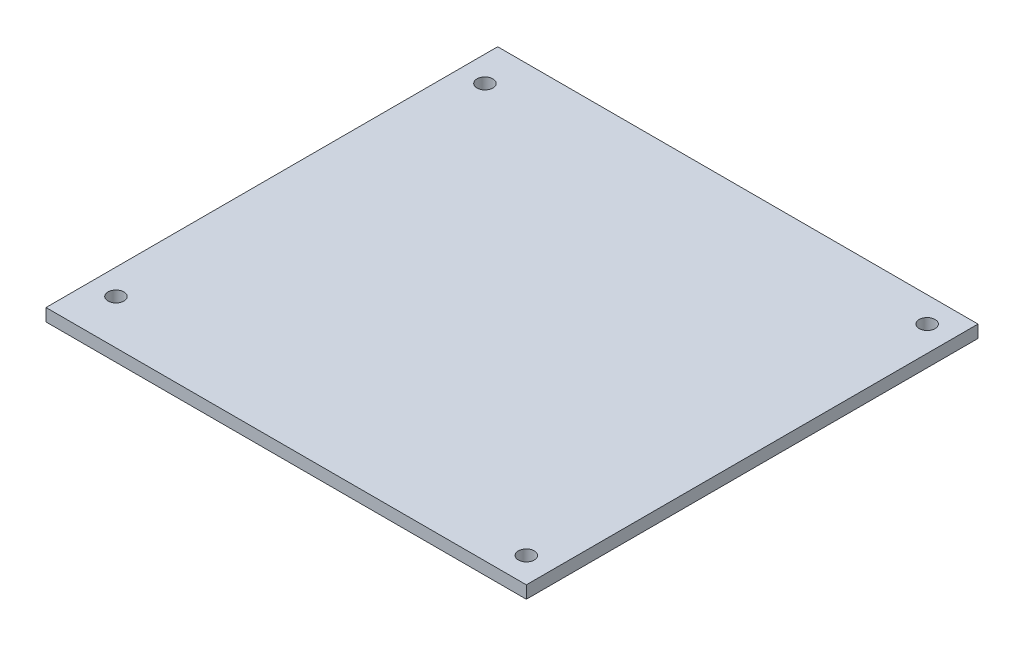
ISO-10303-21;
HEADER;
FILE_DESCRIPTION(('STEP AP214'),'2;1');
FILE_NAME('part.step','',(''),(''),'','','');
FILE_SCHEMA(('AUTOMOTIVE_DESIGN { 1 0 10303 214 1 1 1 1 }'));
ENDSEC;
DATA;
#1=APPLICATION_CONTEXT('core data for automotive mechanical design processes');
#2=APPLICATION_PROTOCOL_DEFINITION('international standard','automotive_design',2000,#1);
#3=PRODUCT_CONTEXT('',#1,'mechanical');
#4=PRODUCT('Part','Part','',(#3));
#5=PRODUCT_RELATED_PRODUCT_CATEGORY('part','',(#4));
#6=PRODUCT_DEFINITION_FORMATION('','',#4);
#7=PRODUCT_DEFINITION_CONTEXT('part definition',#1,'design');
#8=PRODUCT_DEFINITION('design','',#6,#7);
#9=PRODUCT_DEFINITION_SHAPE('','',#8);
#10=(LENGTH_UNIT() NAMED_UNIT(*) SI_UNIT(.MILLI.,.METRE.));
#11=(NAMED_UNIT(*) PLANE_ANGLE_UNIT() SI_UNIT($,.RADIAN.));
#12=(NAMED_UNIT(*) SI_UNIT($,.STERADIAN.) SOLID_ANGLE_UNIT());
#13=UNCERTAINTY_MEASURE_WITH_UNIT(LENGTH_MEASURE(1.E-05),#10,'distance_accuracy_value','');
#14=(GEOMETRIC_REPRESENTATION_CONTEXT(3) GLOBAL_UNCERTAINTY_ASSIGNED_CONTEXT((#13)) GLOBAL_UNIT_ASSIGNED_CONTEXT((#10,
#11,#12)) REPRESENTATION_CONTEXT('',''));
#15=CARTESIAN_POINT('',(0.,0.,0.));
#16=DIRECTION('',(0.,0.,1.));
#17=DIRECTION('',(1.,0.,0.));
#18=AXIS2_PLACEMENT_3D('',#15,#16,#17);
#19=CARTESIAN_POINT('',(0.,2.5,0.));
#20=DIRECTION('',(1.,0.,0.));
#21=DIRECTION('',(0.,0.,-1.));
#22=AXIS2_PLACEMENT_3D('',#19,#20,#21);
#23=PLANE('',#22);
#24=DIRECTION('',(0.,0.,1.));
#25=VECTOR('',#24,1.);
#26=CARTESIAN_POINT('',(0.,0.,0.));
#27=LINE('',#26,#25);
#28=CARTESIAN_POINT('',(0.,0.,-90.17));
#29=VERTEX_POINT('',#28);
#30=CARTESIAN_POINT('',(0.,0.,0.));
#31=VERTEX_POINT('',#30);
#32=EDGE_CURVE('E102',#29,#31,#27,.T.);
#33=ORIENTED_EDGE('',*,*,#32,.T.);
#34=DIRECTION('',(0.,-1.,0.));
#35=VECTOR('',#34,1.);
#36=CARTESIAN_POINT('',(0.,2.5,0.));
#37=LINE('',#36,#35);
#38=CARTESIAN_POINT('',(0.,2.5,0.));
#39=VERTEX_POINT('',#38);
#40=EDGE_CURVE('E11',#39,#31,#37,.T.);
#41=ORIENTED_EDGE('',*,*,#40,.F.);
#42=DIRECTION('',(0.,0.,1.));
#43=VECTOR('',#42,1.);
#44=CARTESIAN_POINT('',(0.,2.5,0.));
#45=LINE('',#44,#43);
#46=CARTESIAN_POINT('',(0.,2.5,-90.17));
#47=VERTEX_POINT('',#46);
#48=EDGE_CURVE('E90',#47,#39,#45,.T.);
#49=ORIENTED_EDGE('',*,*,#48,.F.);
#50=DIRECTION('',(0.,-1.,0.));
#51=VECTOR('',#50,1.);
#52=CARTESIAN_POINT('',(0.,2.5,-90.17));
#53=LINE('',#52,#51);
#54=EDGE_CURVE('E98',#47,#29,#53,.T.);
#55=ORIENTED_EDGE('',*,*,#54,.T.);
#56=EDGE_LOOP('',(#33,#41,#49,#55));
#57=FACE_BOUND('',#56,.T.);
#58=ADVANCED_FACE('F39',(#57),#23,.F.);
#59=CARTESIAN_POINT('',(0.,2.5,0.));
#60=DIRECTION('',(0.,0.,-1.));
#61=DIRECTION('',(-1.,0.,0.));
#62=AXIS2_PLACEMENT_3D('',#59,#60,#61);
#63=PLANE('',#62);
#64=DIRECTION('',(1.,0.,0.));
#65=VECTOR('',#64,1.);
#66=CARTESIAN_POINT('',(0.,0.,0.));
#67=LINE('',#66,#65);
#68=CARTESIAN_POINT('',(95.89,0.,0.));
#69=VERTEX_POINT('',#68);
#70=EDGE_CURVE('E94',#31,#69,#67,.T.);
#71=ORIENTED_EDGE('',*,*,#70,.T.);
#72=DIRECTION('',(0.,-1.,0.));
#73=VECTOR('',#72,1.);
#74=CARTESIAN_POINT('',(95.89,2.5,0.));
#75=LINE('',#74,#73);
#76=CARTESIAN_POINT('',(95.89,2.5,0.));
#77=VERTEX_POINT('',#76);
#78=EDGE_CURVE('E47',#77,#69,#75,.T.);
#79=ORIENTED_EDGE('',*,*,#78,.F.);
#80=DIRECTION('',(1.,0.,0.));
#81=VECTOR('',#80,1.);
#82=CARTESIAN_POINT('',(0.,2.5,0.));
#83=LINE('',#82,#81);
#84=EDGE_CURVE('E85',#39,#77,#83,.T.);
#85=ORIENTED_EDGE('',*,*,#84,.F.);
#86=ORIENTED_EDGE('',*,*,#40,.T.);
#87=EDGE_LOOP('',(#71,#79,#85,#86));
#88=FACE_BOUND('',#87,.T.);
#89=ADVANCED_FACE('F93',(#88),#63,.F.);
#90=CARTESIAN_POINT('',(95.89,2.5,0.));
#91=DIRECTION('',(-1.,0.,0.));
#92=DIRECTION('',(0.,0.,1.));
#93=AXIS2_PLACEMENT_3D('',#90,#91,#92);
#94=PLANE('',#93);
#95=DIRECTION('',(0.,0.,-1.));
#96=VECTOR('',#95,1.);
#97=CARTESIAN_POINT('',(95.89,0.,0.));
#98=LINE('',#97,#96);
#99=CARTESIAN_POINT('',(95.89,0.,-90.17));
#100=VERTEX_POINT('',#99);
#101=EDGE_CURVE('E72',#69,#100,#98,.T.);
#102=ORIENTED_EDGE('',*,*,#101,.T.);
#103=DIRECTION('',(0.,-1.,0.));
#104=VECTOR('',#103,1.);
#105=CARTESIAN_POINT('',(95.89,2.5,-90.17));
#106=LINE('',#105,#104);
#107=CARTESIAN_POINT('',(95.89,2.5,-90.17));
#108=VERTEX_POINT('',#107);
#109=EDGE_CURVE('E95',#108,#100,#106,.T.);
#110=ORIENTED_EDGE('',*,*,#109,.F.);
#111=DIRECTION('',(0.,0.,-1.));
#112=VECTOR('',#111,1.);
#113=CARTESIAN_POINT('',(95.89,2.5,0.));
#114=LINE('',#113,#112);
#115=EDGE_CURVE('E88',#77,#108,#114,.T.);
#116=ORIENTED_EDGE('',*,*,#115,.F.);
#117=ORIENTED_EDGE('',*,*,#78,.T.);
#118=EDGE_LOOP('',(#102,#110,#116,#117));
#119=FACE_BOUND('',#118,.T.);
#120=ADVANCED_FACE('F96',(#119),#94,.F.);
#121=CARTESIAN_POINT('',(0.,2.5,-90.17));
#122=DIRECTION('',(0.,0.,1.));
#123=DIRECTION('',(1.,0.,0.));
#124=AXIS2_PLACEMENT_3D('',#121,#122,#123);
#125=PLANE('',#124);
#126=DIRECTION('',(-1.,0.,0.));
#127=VECTOR('',#126,1.);
#128=CARTESIAN_POINT('',(0.,0.,-90.17));
#129=LINE('',#128,#127);
#130=EDGE_CURVE('E78',#100,#29,#129,.T.);
#131=ORIENTED_EDGE('',*,*,#130,.T.);
#132=ORIENTED_EDGE('',*,*,#54,.F.);
#133=DIRECTION('',(-1.,0.,0.));
#134=VECTOR('',#133,1.);
#135=CARTESIAN_POINT('',(0.,2.5,-90.17));
#136=LINE('',#135,#134);
#137=EDGE_CURVE('E55',#108,#47,#136,.T.);
#138=ORIENTED_EDGE('',*,*,#137,.F.);
#139=ORIENTED_EDGE('',*,*,#109,.T.);
#140=EDGE_LOOP('',(#131,#132,#138,#139));
#141=FACE_BOUND('',#140,.T.);
#142=ADVANCED_FACE('F110',(#141),#125,.F.);
#143=CARTESIAN_POINT('',(0.,2.5,0.));
#144=DIRECTION('',(0.,-1.,0.));
#145=DIRECTION('',(0.,0.,-1.));
#146=AXIS2_PLACEMENT_3D('',#143,#144,#145);
#147=PLANE('',#146);
#148=CARTESIAN_POINT('',(5.07999999999999,2.5,-82.55));
#149=DIRECTION('',(0.,1.,0.));
#150=DIRECTION('',(0.,0.,1.));
#151=AXIS2_PLACEMENT_3D('',#148,#149,#150);
#152=CIRCLE('',#151,1.59);
#153=CARTESIAN_POINT('',(5.07999999999999,2.5,-80.96));
#154=VERTEX_POINT('',#153);
#155=EDGE_CURVE('E136',#154,#154,#152,.T.);
#156=ORIENTED_EDGE('',*,*,#155,.F.);
#157=EDGE_LOOP('',(#156));
#158=FACE_BOUND('',#157,.T.);
#159=CARTESIAN_POINT('',(5.07999999999998,2.5,-8.89));
#160=DIRECTION('',(0.,1.,0.));
#161=DIRECTION('',(0.,0.,1.));
#162=AXIS2_PLACEMENT_3D('',#159,#160,#161);
#163=CIRCLE('',#162,1.59);
#164=CARTESIAN_POINT('',(5.07999999999998,2.5,-7.3));
#165=VERTEX_POINT('',#164);
#166=EDGE_CURVE('E130',#165,#165,#163,.T.);
#167=ORIENTED_EDGE('',*,*,#166,.F.);
#168=EDGE_LOOP('',(#167));
#169=FACE_BOUND('',#168,.T.);
#170=CARTESIAN_POINT('',(90.81,2.5,-85.09));
#171=DIRECTION('',(0.,1.,0.));
#172=DIRECTION('',(0.,0.,1.));
#173=AXIS2_PLACEMENT_3D('',#170,#171,#172);
#174=CIRCLE('',#173,1.58999999999999);
#175=CARTESIAN_POINT('',(90.81,2.5,-83.5));
#176=VERTEX_POINT('',#175);
#177=EDGE_CURVE('E124',#176,#176,#174,.T.);
#178=ORIENTED_EDGE('',*,*,#177,.F.);
#179=EDGE_LOOP('',(#178));
#180=FACE_BOUND('',#179,.T.);
#181=CARTESIAN_POINT('',(90.81,2.5,-5.08));
#182=DIRECTION('',(0.,1.,0.));
#183=DIRECTION('',(0.,0.,1.));
#184=AXIS2_PLACEMENT_3D('',#181,#182,#183);
#185=CIRCLE('',#184,1.58999999999999);
#186=CARTESIAN_POINT('',(90.81,2.5,-3.49000000000001));
#187=VERTEX_POINT('',#186);
#188=EDGE_CURVE('E118',#187,#187,#185,.T.);
#189=ORIENTED_EDGE('',*,*,#188,.F.);
#190=EDGE_LOOP('',(#189));
#191=FACE_BOUND('',#190,.T.);
#192=ORIENTED_EDGE('',*,*,#48,.T.);
#193=ORIENTED_EDGE('',*,*,#84,.T.);
#194=ORIENTED_EDGE('',*,*,#115,.T.);
#195=ORIENTED_EDGE('',*,*,#137,.T.);
#196=EDGE_LOOP('',(#192,#193,#194,#195));
#197=FACE_BOUND('',#196,.T.);
#198=ADVANCED_FACE('F86',(#158,#169,#180,#191,#197),#147,.F.);
#199=CARTESIAN_POINT('',(0.,0.,0.));
#200=DIRECTION('',(0.,-1.,0.));
#201=DIRECTION('',(0.,0.,-1.));
#202=AXIS2_PLACEMENT_3D('',#199,#200,#201);
#203=PLANE('',#202);
#204=CARTESIAN_POINT('',(5.07999999999999,0.,-82.55));
#205=DIRECTION('',(0.,1.,0.));
#206=DIRECTION('',(0.,0.,1.));
#207=AXIS2_PLACEMENT_3D('',#204,#205,#206);
#208=CIRCLE('',#207,1.59);
#209=CARTESIAN_POINT('',(5.07999999999999,0.,-80.96));
#210=VERTEX_POINT('',#209);
#211=EDGE_CURVE('E133',#210,#210,#208,.T.);
#212=ORIENTED_EDGE('',*,*,#211,.T.);
#213=EDGE_LOOP('',(#212));
#214=FACE_BOUND('',#213,.T.);
#215=CARTESIAN_POINT('',(5.07999999999998,0.,-8.89));
#216=DIRECTION('',(0.,1.,0.));
#217=DIRECTION('',(0.,0.,1.));
#218=AXIS2_PLACEMENT_3D('',#215,#216,#217);
#219=CIRCLE('',#218,1.59);
#220=CARTESIAN_POINT('',(5.07999999999998,0.,-7.3));
#221=VERTEX_POINT('',#220);
#222=EDGE_CURVE('E127',#221,#221,#219,.T.);
#223=ORIENTED_EDGE('',*,*,#222,.T.);
#224=EDGE_LOOP('',(#223));
#225=FACE_BOUND('',#224,.T.);
#226=CARTESIAN_POINT('',(90.81,0.,-85.09));
#227=DIRECTION('',(0.,1.,0.));
#228=DIRECTION('',(0.,0.,1.));
#229=AXIS2_PLACEMENT_3D('',#226,#227,#228);
#230=CIRCLE('',#229,1.58999999999999);
#231=CARTESIAN_POINT('',(90.81,0.,-83.5));
#232=VERTEX_POINT('',#231);
#233=EDGE_CURVE('E121',#232,#232,#230,.T.);
#234=ORIENTED_EDGE('',*,*,#233,.T.);
#235=EDGE_LOOP('',(#234));
#236=FACE_BOUND('',#235,.T.);
#237=CARTESIAN_POINT('',(90.81,0.,-5.08));
#238=DIRECTION('',(0.,1.,0.));
#239=DIRECTION('',(0.,0.,1.));
#240=AXIS2_PLACEMENT_3D('',#237,#238,#239);
#241=CIRCLE('',#240,1.58999999999999);
#242=CARTESIAN_POINT('',(90.81,0.,-3.49000000000001));
#243=VERTEX_POINT('',#242);
#244=EDGE_CURVE('E105',#243,#243,#241,.T.);
#245=ORIENTED_EDGE('',*,*,#244,.T.);
#246=EDGE_LOOP('',(#245));
#247=FACE_BOUND('',#246,.T.);
#248=ORIENTED_EDGE('',*,*,#32,.F.);
#249=ORIENTED_EDGE('',*,*,#130,.F.);
#250=ORIENTED_EDGE('',*,*,#101,.F.);
#251=ORIENTED_EDGE('',*,*,#70,.F.);
#252=EDGE_LOOP('',(#248,#249,#250,#251));
#253=FACE_BOUND('',#252,.T.);
#254=ADVANCED_FACE('F113',(#214,#225,#236,#247,#253),#203,.T.);
#255=CARTESIAN_POINT('',(90.81,2.5,-5.08));
#256=DIRECTION('',(0.,1.,0.));
#257=DIRECTION('',(0.,0.,1.));
#258=AXIS2_PLACEMENT_3D('',#255,#256,#257);
#259=CYLINDRICAL_SURFACE('',#258,1.58999999999999);
#260=ORIENTED_EDGE('',*,*,#244,.F.);
#261=EDGE_LOOP('',(#260));
#262=FACE_BOUND('',#261,.T.);
#263=ORIENTED_EDGE('',*,*,#188,.T.);
#264=EDGE_LOOP('',(#263));
#265=FACE_BOUND('',#264,.T.);
#266=ADVANCED_FACE('F151',(#262,#265),#259,.F.);
#267=CARTESIAN_POINT('',(90.81,2.5,-85.09));
#268=DIRECTION('',(0.,1.,0.));
#269=DIRECTION('',(0.,0.,1.));
#270=AXIS2_PLACEMENT_3D('',#267,#268,#269);
#271=CYLINDRICAL_SURFACE('',#270,1.58999999999999);
#272=ORIENTED_EDGE('',*,*,#233,.F.);
#273=EDGE_LOOP('',(#272));
#274=FACE_BOUND('',#273,.T.);
#275=ORIENTED_EDGE('',*,*,#177,.T.);
#276=EDGE_LOOP('',(#275));
#277=FACE_BOUND('',#276,.T.);
#278=ADVANCED_FACE('F153',(#274,#277),#271,.F.);
#279=CARTESIAN_POINT('',(5.07999999999998,2.5,-8.89));
#280=DIRECTION('',(0.,1.,0.));
#281=DIRECTION('',(0.,0.,1.));
#282=AXIS2_PLACEMENT_3D('',#279,#280,#281);
#283=CYLINDRICAL_SURFACE('',#282,1.59);
#284=ORIENTED_EDGE('',*,*,#222,.F.);
#285=EDGE_LOOP('',(#284));
#286=FACE_BOUND('',#285,.T.);
#287=ORIENTED_EDGE('',*,*,#166,.T.);
#288=EDGE_LOOP('',(#287));
#289=FACE_BOUND('',#288,.T.);
#290=ADVANCED_FACE('F160',(#286,#289),#283,.F.);
#291=CARTESIAN_POINT('',(5.07999999999999,2.5,-82.55));
#292=DIRECTION('',(0.,1.,0.));
#293=DIRECTION('',(0.,0.,1.));
#294=AXIS2_PLACEMENT_3D('',#291,#292,#293);
#295=CYLINDRICAL_SURFACE('',#294,1.59);
#296=ORIENTED_EDGE('',*,*,#211,.F.);
#297=EDGE_LOOP('',(#296));
#298=FACE_BOUND('',#297,.T.);
#299=ORIENTED_EDGE('',*,*,#155,.T.);
#300=EDGE_LOOP('',(#299));
#301=FACE_BOUND('',#300,.T.);
#302=ADVANCED_FACE('F140',(#298,#301),#295,.F.);
#303=CLOSED_SHELL('',(#58,#89,#120,#142,#198,#254,#266,#278,#290,#302));
#304=MANIFOLD_SOLID_BREP('B2',#303);
#305=ADVANCED_BREP_SHAPE_REPRESENTATION('',(#18,#304),#14);
#306=SHAPE_DEFINITION_REPRESENTATION(#9,#305);
ENDSEC;
END-ISO-10303-21;
